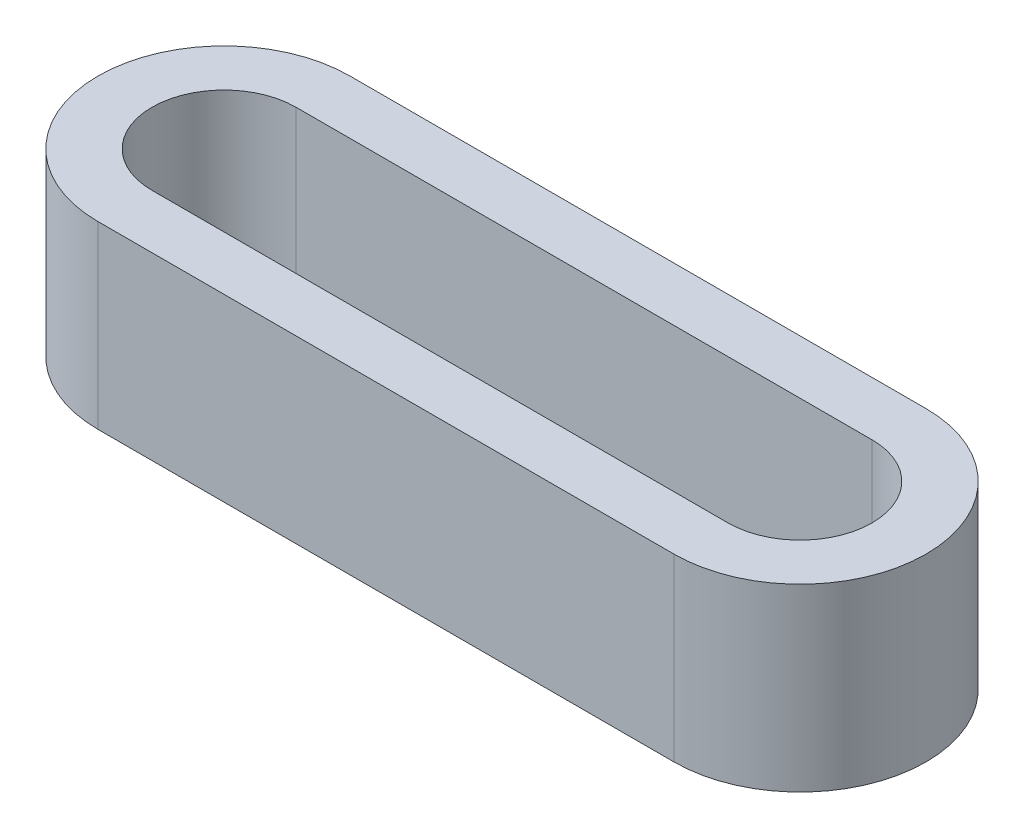
ISO-10303-21;
HEADER;
FILE_DESCRIPTION(('STEP AP214'),'2;1');
FILE_NAME('part.step','',(''),(''),'','','');
FILE_SCHEMA(('AUTOMOTIVE_DESIGN { 1 0 10303 214 1 1 1 1 }'));
ENDSEC;
DATA;
#1=APPLICATION_CONTEXT('core data for automotive mechanical design processes');
#2=APPLICATION_PROTOCOL_DEFINITION('international standard','automotive_design',2000,#1);
#3=PRODUCT_CONTEXT('',#1,'mechanical');
#4=PRODUCT('Part','Part','',(#3));
#5=PRODUCT_RELATED_PRODUCT_CATEGORY('part','',(#4));
#6=PRODUCT_DEFINITION_FORMATION('','',#4);
#7=PRODUCT_DEFINITION_CONTEXT('part definition',#1,'design');
#8=PRODUCT_DEFINITION('design','',#6,#7);
#9=PRODUCT_DEFINITION_SHAPE('','',#8);
#10=(LENGTH_UNIT() NAMED_UNIT(*) SI_UNIT(.MILLI.,.METRE.));
#11=(NAMED_UNIT(*) PLANE_ANGLE_UNIT() SI_UNIT($,.RADIAN.));
#12=(NAMED_UNIT(*) SI_UNIT($,.STERADIAN.) SOLID_ANGLE_UNIT());
#13=UNCERTAINTY_MEASURE_WITH_UNIT(LENGTH_MEASURE(1.E-05),#10,'distance_accuracy_value','');
#14=(GEOMETRIC_REPRESENTATION_CONTEXT(3) GLOBAL_UNCERTAINTY_ASSIGNED_CONTEXT((#13)) GLOBAL_UNIT_ASSIGNED_CONTEXT((#10,
#11,#12)) REPRESENTATION_CONTEXT('',''));
#15=CARTESIAN_POINT('',(0.,0.,0.));
#16=DIRECTION('',(0.,0.,1.));
#17=DIRECTION('',(1.,0.,0.));
#18=AXIS2_PLACEMENT_3D('',#15,#16,#17);
#19=CARTESIAN_POINT('',(0.,10.,0.));
#20=DIRECTION('',(0.,1.,0.));
#21=DIRECTION('',(0.,0.,1.));
#22=AXIS2_PLACEMENT_3D('',#19,#20,#21);
#23=PLANE('',#22);
#24=CARTESIAN_POINT('',(0.,10.,0.));
#25=DIRECTION('',(0.,1.,0.));
#26=DIRECTION('',(0.,0.,1.));
#27=AXIS2_PLACEMENT_3D('',#24,#25,#26);
#28=CIRCLE('',#27,7.);
#29=CARTESIAN_POINT('',(0.,10.,-7.));
#30=VERTEX_POINT('',#29);
#31=CARTESIAN_POINT('',(0.,10.,7.));
#32=VERTEX_POINT('',#31);
#33=EDGE_CURVE('E159',#30,#32,#28,.T.);
#34=ORIENTED_EDGE('',*,*,#33,.T.);
#35=DIRECTION('',(1.,0.,0.));
#36=VECTOR('',#35,1.);
#37=CARTESIAN_POINT('',(0.,10.,7.));
#38=LINE('',#37,#36);
#39=CARTESIAN_POINT('',(32.,10.,7.));
#40=VERTEX_POINT('',#39);
#41=EDGE_CURVE('E163',#32,#40,#38,.T.);
#42=ORIENTED_EDGE('',*,*,#41,.T.);
#43=CARTESIAN_POINT('',(32.,10.,0.));
#44=DIRECTION('',(0.,1.,0.));
#45=DIRECTION('',(0.,0.,1.));
#46=AXIS2_PLACEMENT_3D('',#43,#44,#45);
#47=CIRCLE('',#46,7.);
#48=CARTESIAN_POINT('',(32.,10.,-7.));
#49=VERTEX_POINT('',#48);
#50=EDGE_CURVE('E167',#40,#49,#47,.T.);
#51=ORIENTED_EDGE('',*,*,#50,.T.);
#52=DIRECTION('',(-1.,0.,0.));
#53=VECTOR('',#52,1.);
#54=CARTESIAN_POINT('',(0.,10.,-7.));
#55=LINE('',#54,#53);
#56=EDGE_CURVE('E170',#49,#30,#55,.T.);
#57=ORIENTED_EDGE('',*,*,#56,.T.);
#58=EDGE_LOOP('',(#34,#42,#51,#57));
#59=FACE_BOUND('',#58,.T.);
#60=DIRECTION('',(1.,0.,0.));
#61=VECTOR('',#60,1.);
#62=CARTESIAN_POINT('',(0.,10.,4.));
#63=LINE('',#62,#61);
#64=CARTESIAN_POINT('',(0.,10.,4.));
#65=VERTEX_POINT('',#64);
#66=CARTESIAN_POINT('',(32.,10.,4.));
#67=VERTEX_POINT('',#66);
#68=EDGE_CURVE('E120',#65,#67,#63,.T.);
#69=ORIENTED_EDGE('',*,*,#68,.F.);
#70=CARTESIAN_POINT('',(0.,10.,0.));
#71=DIRECTION('',(0.,1.,0.));
#72=DIRECTION('',(0.,0.,1.));
#73=AXIS2_PLACEMENT_3D('',#70,#71,#72);
#74=CIRCLE('',#73,4.);
#75=CARTESIAN_POINT('',(0.,10.,-4.));
#76=VERTEX_POINT('',#75);
#77=EDGE_CURVE('E111',#76,#65,#74,.T.);
#78=ORIENTED_EDGE('',*,*,#77,.F.);
#79=DIRECTION('',(-1.,0.,0.));
#80=VECTOR('',#79,1.);
#81=CARTESIAN_POINT('',(0.,10.,-4.));
#82=LINE('',#81,#80);
#83=CARTESIAN_POINT('',(32.,10.,-4.));
#84=VERTEX_POINT('',#83);
#85=EDGE_CURVE('E137',#84,#76,#82,.T.);
#86=ORIENTED_EDGE('',*,*,#85,.F.);
#87=CARTESIAN_POINT('',(32.,10.,0.));
#88=DIRECTION('',(0.,1.,0.));
#89=DIRECTION('',(0.,0.,1.));
#90=AXIS2_PLACEMENT_3D('',#87,#88,#89);
#91=CIRCLE('',#90,4.);
#92=EDGE_CURVE('E133',#67,#84,#91,.T.);
#93=ORIENTED_EDGE('',*,*,#92,.F.);
#94=EDGE_LOOP('',(#69,#78,#86,#93));
#95=FACE_BOUND('',#94,.T.);
#96=ADVANCED_FACE('F45',(#59,#95),#23,.T.);
#97=CARTESIAN_POINT('',(0.,0.,0.));
#98=DIRECTION('',(0.,1.,0.));
#99=DIRECTION('',(0.,0.,1.));
#100=AXIS2_PLACEMENT_3D('',#97,#98,#99);
#101=PLANE('',#100);
#102=CARTESIAN_POINT('',(0.,0.,0.));
#103=DIRECTION('',(0.,1.,0.));
#104=DIRECTION('',(0.,0.,1.));
#105=AXIS2_PLACEMENT_3D('',#102,#103,#104);
#106=CIRCLE('',#105,7.);
#107=CARTESIAN_POINT('',(0.,0.,-7.));
#108=VERTEX_POINT('',#107);
#109=CARTESIAN_POINT('',(0.,0.,7.));
#110=VERTEX_POINT('',#109);
#111=EDGE_CURVE('E129',#108,#110,#106,.T.);
#112=ORIENTED_EDGE('',*,*,#111,.F.);
#113=DIRECTION('',(-1.,0.,0.));
#114=VECTOR('',#113,1.);
#115=CARTESIAN_POINT('',(0.,0.,-7.));
#116=LINE('',#115,#114);
#117=CARTESIAN_POINT('',(32.,0.,-7.));
#118=VERTEX_POINT('',#117);
#119=EDGE_CURVE('E164',#118,#108,#116,.T.);
#120=ORIENTED_EDGE('',*,*,#119,.F.);
#121=CARTESIAN_POINT('',(32.,0.,0.));
#122=DIRECTION('',(0.,1.,0.));
#123=DIRECTION('',(0.,0.,1.));
#124=AXIS2_PLACEMENT_3D('',#121,#122,#123);
#125=CIRCLE('',#124,7.);
#126=CARTESIAN_POINT('',(32.,0.,7.));
#127=VERTEX_POINT('',#126);
#128=EDGE_CURVE('E180',#127,#118,#125,.T.);
#129=ORIENTED_EDGE('',*,*,#128,.F.);
#130=DIRECTION('',(1.,0.,0.));
#131=VECTOR('',#130,1.);
#132=CARTESIAN_POINT('',(0.,0.,7.));
#133=LINE('',#132,#131);
#134=EDGE_CURVE('E177',#110,#127,#133,.T.);
#135=ORIENTED_EDGE('',*,*,#134,.F.);
#136=EDGE_LOOP('',(#112,#120,#129,#135));
#137=FACE_BOUND('',#136,.T.);
#138=CARTESIAN_POINT('',(0.,0.,0.));
#139=DIRECTION('',(0.,1.,0.));
#140=DIRECTION('',(0.,0.,1.));
#141=AXIS2_PLACEMENT_3D('',#138,#139,#140);
#142=CIRCLE('',#141,4.);
#143=CARTESIAN_POINT('',(0.,0.,-4.));
#144=VERTEX_POINT('',#143);
#145=CARTESIAN_POINT('',(0.,0.,4.));
#146=VERTEX_POINT('',#145);
#147=EDGE_CURVE('E69',#144,#146,#142,.T.);
#148=ORIENTED_EDGE('',*,*,#147,.T.);
#149=DIRECTION('',(1.,0.,0.));
#150=VECTOR('',#149,1.);
#151=CARTESIAN_POINT('',(0.,0.,4.));
#152=LINE('',#151,#150);
#153=CARTESIAN_POINT('',(32.,0.,4.));
#154=VERTEX_POINT('',#153);
#155=EDGE_CURVE('E127',#146,#154,#152,.T.);
#156=ORIENTED_EDGE('',*,*,#155,.T.);
#157=CARTESIAN_POINT('',(32.,0.,0.));
#158=DIRECTION('',(0.,1.,0.));
#159=DIRECTION('',(0.,0.,1.));
#160=AXIS2_PLACEMENT_3D('',#157,#158,#159);
#161=CIRCLE('',#160,4.);
#162=CARTESIAN_POINT('',(32.,0.,-4.));
#163=VERTEX_POINT('',#162);
#164=EDGE_CURVE('E146',#154,#163,#161,.T.);
#165=ORIENTED_EDGE('',*,*,#164,.T.);
#166=DIRECTION('',(-1.,0.,0.));
#167=VECTOR('',#166,1.);
#168=CARTESIAN_POINT('',(0.,0.,-4.));
#169=LINE('',#168,#167);
#170=EDGE_CURVE('E121',#163,#144,#169,.T.);
#171=ORIENTED_EDGE('',*,*,#170,.T.);
#172=EDGE_LOOP('',(#148,#156,#165,#171));
#173=FACE_BOUND('',#172,.T.);
#174=ADVANCED_FACE('F203',(#137,#173),#101,.F.);
#175=CARTESIAN_POINT('',(0.,10.,0.));
#176=DIRECTION('',(0.,-1.,0.));
#177=DIRECTION('',(0.,0.,-1.));
#178=AXIS2_PLACEMENT_3D('',#175,#176,#177);
#179=CYLINDRICAL_SURFACE('',#178,7.);
#180=ORIENTED_EDGE('',*,*,#111,.T.);
#181=DIRECTION('',(0.,-1.,0.));
#182=VECTOR('',#181,1.);
#183=CARTESIAN_POINT('',(0.,10.,7.));
#184=LINE('',#183,#182);
#185=EDGE_CURVE('E11',#32,#110,#184,.T.);
#186=ORIENTED_EDGE('',*,*,#185,.F.);
#187=ORIENTED_EDGE('',*,*,#33,.F.);
#188=DIRECTION('',(0.,-1.,0.));
#189=VECTOR('',#188,1.);
#190=CARTESIAN_POINT('',(0.,10.,-7.));
#191=LINE('',#190,#189);
#192=EDGE_CURVE('E173',#30,#108,#191,.T.);
#193=ORIENTED_EDGE('',*,*,#192,.T.);
#194=EDGE_LOOP('',(#180,#186,#187,#193));
#195=FACE_BOUND('',#194,.T.);
#196=ADVANCED_FACE('F47',(#195),#179,.T.);
#197=CARTESIAN_POINT('',(0.,10.,7.));
#198=DIRECTION('',(0.,0.,-1.));
#199=DIRECTION('',(-1.,0.,0.));
#200=AXIS2_PLACEMENT_3D('',#197,#198,#199);
#201=PLANE('',#200);
#202=ORIENTED_EDGE('',*,*,#134,.T.);
#203=DIRECTION('',(0.,-1.,0.));
#204=VECTOR('',#203,1.);
#205=CARTESIAN_POINT('',(32.,10.,7.));
#206=LINE('',#205,#204);
#207=EDGE_CURVE('E54',#40,#127,#206,.T.);
#208=ORIENTED_EDGE('',*,*,#207,.F.);
#209=ORIENTED_EDGE('',*,*,#41,.F.);
#210=ORIENTED_EDGE('',*,*,#185,.T.);
#211=EDGE_LOOP('',(#202,#208,#209,#210));
#212=FACE_BOUND('',#211,.T.);
#213=ADVANCED_FACE('F213',(#212),#201,.F.);
#214=CARTESIAN_POINT('',(32.,10.,0.));
#215=DIRECTION('',(0.,-1.,0.));
#216=DIRECTION('',(0.,0.,-1.));
#217=AXIS2_PLACEMENT_3D('',#214,#215,#216);
#218=CYLINDRICAL_SURFACE('',#217,7.);
#219=ORIENTED_EDGE('',*,*,#128,.T.);
#220=DIRECTION('',(0.,-1.,0.));
#221=VECTOR('',#220,1.);
#222=CARTESIAN_POINT('',(32.,10.,-7.));
#223=LINE('',#222,#221);
#224=EDGE_CURVE('E188',#49,#118,#223,.T.);
#225=ORIENTED_EDGE('',*,*,#224,.F.);
#226=ORIENTED_EDGE('',*,*,#50,.F.);
#227=ORIENTED_EDGE('',*,*,#207,.T.);
#228=EDGE_LOOP('',(#219,#225,#226,#227));
#229=FACE_BOUND('',#228,.T.);
#230=ADVANCED_FACE('F197',(#229),#218,.T.);
#231=CARTESIAN_POINT('',(0.,10.,-7.));
#232=DIRECTION('',(0.,0.,1.));
#233=DIRECTION('',(1.,0.,0.));
#234=AXIS2_PLACEMENT_3D('',#231,#232,#233);
#235=PLANE('',#234);
#236=ORIENTED_EDGE('',*,*,#119,.T.);
#237=ORIENTED_EDGE('',*,*,#192,.F.);
#238=ORIENTED_EDGE('',*,*,#56,.F.);
#239=ORIENTED_EDGE('',*,*,#224,.T.);
#240=EDGE_LOOP('',(#236,#237,#238,#239));
#241=FACE_BOUND('',#240,.T.);
#242=ADVANCED_FACE('F207',(#241),#235,.F.);
#243=CARTESIAN_POINT('',(0.,10.,0.));
#244=DIRECTION('',(0.,-1.,0.));
#245=DIRECTION('',(0.,0.,-1.));
#246=AXIS2_PLACEMENT_3D('',#243,#244,#245);
#247=CYLINDRICAL_SURFACE('',#246,4.);
#248=ORIENTED_EDGE('',*,*,#147,.F.);
#249=DIRECTION('',(0.,-1.,0.));
#250=VECTOR('',#249,1.);
#251=CARTESIAN_POINT('',(0.,10.,-4.));
#252=LINE('',#251,#250);
#253=EDGE_CURVE('E115',#76,#144,#252,.T.);
#254=ORIENTED_EDGE('',*,*,#253,.F.);
#255=ORIENTED_EDGE('',*,*,#77,.T.);
#256=DIRECTION('',(0.,-1.,0.));
#257=VECTOR('',#256,1.);
#258=CARTESIAN_POINT('',(0.,10.,4.));
#259=LINE('',#258,#257);
#260=EDGE_CURVE('E114',#65,#146,#259,.T.);
#261=ORIENTED_EDGE('',*,*,#260,.T.);
#262=EDGE_LOOP('',(#248,#254,#255,#261));
#263=FACE_BOUND('',#262,.T.);
#264=ADVANCED_FACE('F113',(#263),#247,.F.);
#265=CARTESIAN_POINT('',(0.,10.,4.));
#266=DIRECTION('',(0.,0.,-1.));
#267=DIRECTION('',(-1.,0.,0.));
#268=AXIS2_PLACEMENT_3D('',#265,#266,#267);
#269=PLANE('',#268);
#270=ORIENTED_EDGE('',*,*,#155,.F.);
#271=ORIENTED_EDGE('',*,*,#260,.F.);
#272=ORIENTED_EDGE('',*,*,#68,.T.);
#273=DIRECTION('',(0.,-1.,0.));
#274=VECTOR('',#273,1.);
#275=CARTESIAN_POINT('',(32.,10.,4.));
#276=LINE('',#275,#274);
#277=EDGE_CURVE('E130',#67,#154,#276,.T.);
#278=ORIENTED_EDGE('',*,*,#277,.T.);
#279=EDGE_LOOP('',(#270,#271,#272,#278));
#280=FACE_BOUND('',#279,.T.);
#281=ADVANCED_FACE('F124',(#280),#269,.T.);
#282=CARTESIAN_POINT('',(32.,10.,0.));
#283=DIRECTION('',(0.,-1.,0.));
#284=DIRECTION('',(0.,0.,-1.));
#285=AXIS2_PLACEMENT_3D('',#282,#283,#284);
#286=CYLINDRICAL_SURFACE('',#285,4.);
#287=ORIENTED_EDGE('',*,*,#164,.F.);
#288=ORIENTED_EDGE('',*,*,#277,.F.);
#289=ORIENTED_EDGE('',*,*,#92,.T.);
#290=DIRECTION('',(0.,-1.,0.));
#291=VECTOR('',#290,1.);
#292=CARTESIAN_POINT('',(32.,10.,-4.));
#293=LINE('',#292,#291);
#294=EDGE_CURVE('E61',#84,#163,#293,.T.);
#295=ORIENTED_EDGE('',*,*,#294,.T.);
#296=EDGE_LOOP('',(#287,#288,#289,#295));
#297=FACE_BOUND('',#296,.T.);
#298=ADVANCED_FACE('F236',(#297),#286,.F.);
#299=CARTESIAN_POINT('',(0.,10.,-4.));
#300=DIRECTION('',(0.,0.,1.));
#301=DIRECTION('',(1.,0.,0.));
#302=AXIS2_PLACEMENT_3D('',#299,#300,#301);
#303=PLANE('',#302);
#304=ORIENTED_EDGE('',*,*,#170,.F.);
#305=ORIENTED_EDGE('',*,*,#294,.F.);
#306=ORIENTED_EDGE('',*,*,#85,.T.);
#307=ORIENTED_EDGE('',*,*,#253,.T.);
#308=EDGE_LOOP('',(#304,#305,#306,#307));
#309=FACE_BOUND('',#308,.T.);
#310=ADVANCED_FACE('F240',(#309),#303,.T.);
#311=CLOSED_SHELL('',(#96,#174,#196,#213,#230,#242,#264,#281,#298,#310));
#312=MANIFOLD_SOLID_BREP('B2',#311);
#313=ADVANCED_BREP_SHAPE_REPRESENTATION('',(#18,#312),#14);
#314=SHAPE_DEFINITION_REPRESENTATION(#9,#313);
ENDSEC;
END-ISO-10303-21;
